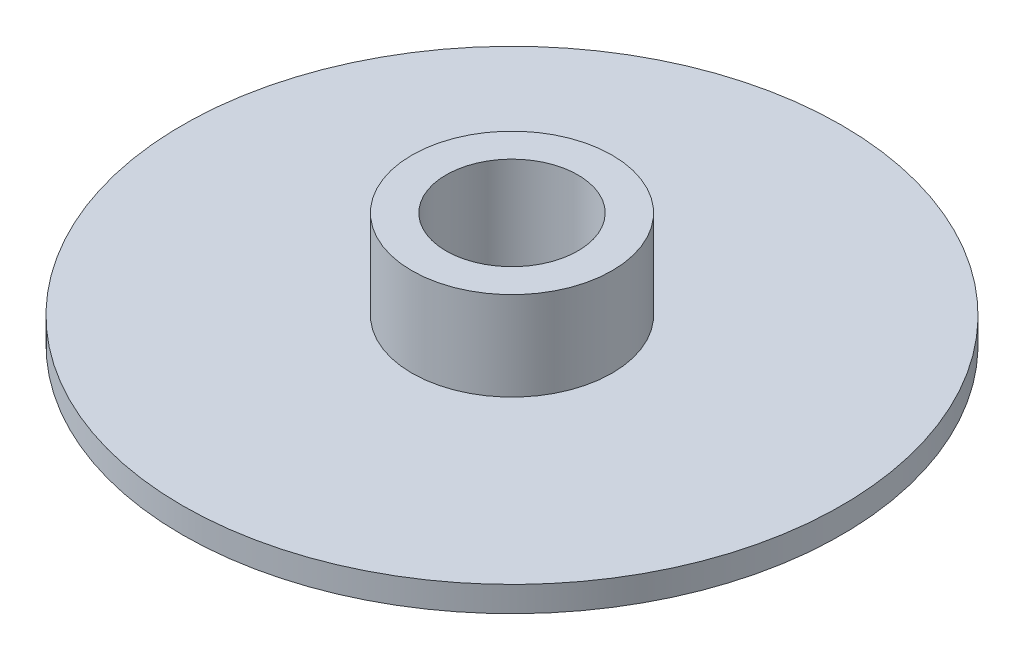
ISO-10303-21;
HEADER;
FILE_DESCRIPTION(('STEP AP214'),'2;1');
FILE_NAME('part.step','',(''),(''),'','','');
FILE_SCHEMA(('AUTOMOTIVE_DESIGN { 1 0 10303 214 1 1 1 1 }'));
ENDSEC;
DATA;
#1=APPLICATION_CONTEXT('core data for automotive mechanical design processes');
#2=APPLICATION_PROTOCOL_DEFINITION('international standard','automotive_design',2000,#1);
#3=PRODUCT_CONTEXT('',#1,'mechanical');
#4=PRODUCT('Part','Part','',(#3));
#5=PRODUCT_RELATED_PRODUCT_CATEGORY('part','',(#4));
#6=PRODUCT_DEFINITION_FORMATION('','',#4);
#7=PRODUCT_DEFINITION_CONTEXT('part definition',#1,'design');
#8=PRODUCT_DEFINITION('design','',#6,#7);
#9=PRODUCT_DEFINITION_SHAPE('','',#8);
#10=(LENGTH_UNIT() NAMED_UNIT(*) SI_UNIT(.MILLI.,.METRE.));
#11=(NAMED_UNIT(*) PLANE_ANGLE_UNIT() SI_UNIT($,.RADIAN.));
#12=(NAMED_UNIT(*) SI_UNIT($,.STERADIAN.) SOLID_ANGLE_UNIT());
#13=UNCERTAINTY_MEASURE_WITH_UNIT(LENGTH_MEASURE(1.E-05),#10,'distance_accuracy_value','');
#14=(GEOMETRIC_REPRESENTATION_CONTEXT(3) GLOBAL_UNCERTAINTY_ASSIGNED_CONTEXT((#13)) GLOBAL_UNIT_ASSIGNED_CONTEXT((#10,
#11,#12)) REPRESENTATION_CONTEXT('',''));
#15=CARTESIAN_POINT('',(0.,0.,0.));
#16=DIRECTION('',(0.,0.,1.));
#17=DIRECTION('',(1.,0.,0.));
#18=AXIS2_PLACEMENT_3D('',#15,#16,#17);
#19=CARTESIAN_POINT('',(0.,1.,0.));
#20=DIRECTION('',(0.,-1.,0.));
#21=DIRECTION('',(0.,0.,-1.));
#22=AXIS2_PLACEMENT_3D('',#19,#20,#21);
#23=CYLINDRICAL_SURFACE('',#22,13.);
#24=CARTESIAN_POINT('',(0.,1.,0.));
#25=DIRECTION('',(0.,1.,0.));
#26=DIRECTION('',(0.,0.,1.));
#27=AXIS2_PLACEMENT_3D('',#24,#25,#26);
#28=CIRCLE('',#27,13.);
#29=CARTESIAN_POINT('',(0.,1.,13.));
#30=VERTEX_POINT('',#29);
#31=EDGE_CURVE('E49',#30,#30,#28,.T.);
#32=ORIENTED_EDGE('',*,*,#31,.F.);
#33=EDGE_LOOP('',(#32));
#34=FACE_BOUND('',#33,.T.);
#35=CARTESIAN_POINT('',(0.,0.,0.));
#36=DIRECTION('',(0.,1.,0.));
#37=DIRECTION('',(0.,0.,1.));
#38=AXIS2_PLACEMENT_3D('',#35,#36,#37);
#39=CIRCLE('',#38,13.);
#40=CARTESIAN_POINT('',(0.,0.,13.));
#41=VERTEX_POINT('',#40);
#42=EDGE_CURVE('E45',#41,#41,#39,.T.);
#43=ORIENTED_EDGE('',*,*,#42,.T.);
#44=EDGE_LOOP('',(#43));
#45=FACE_BOUND('',#44,.T.);
#46=ADVANCED_FACE('F42',(#34,#45),#23,.T.);
#47=CARTESIAN_POINT('',(0.,1.,0.));
#48=DIRECTION('',(0.,1.,0.));
#49=DIRECTION('',(0.,0.,1.));
#50=AXIS2_PLACEMENT_3D('',#47,#48,#49);
#51=PLANE('',#50);
#52=CARTESIAN_POINT('',(0.,1.,0.));
#53=DIRECTION('',(0.,1.,0.));
#54=DIRECTION('',(0.,0.,1.));
#55=AXIS2_PLACEMENT_3D('',#52,#53,#54);
#56=CIRCLE('',#55,3.95);
#57=CARTESIAN_POINT('',(0.,1.,3.95));
#58=VERTEX_POINT('',#57);
#59=EDGE_CURVE('E12',#58,#58,#56,.T.);
#60=ORIENTED_EDGE('',*,*,#59,.F.);
#61=EDGE_LOOP('',(#60));
#62=FACE_BOUND('',#61,.T.);
#63=ORIENTED_EDGE('',*,*,#31,.T.);
#64=EDGE_LOOP('',(#63));
#65=FACE_BOUND('',#64,.T.);
#66=ADVANCED_FACE('F86',(#62,#65),#51,.T.);
#67=CARTESIAN_POINT('',(0.,0.,0.));
#68=DIRECTION('',(0.,1.,0.));
#69=DIRECTION('',(0.,0.,1.));
#70=AXIS2_PLACEMENT_3D('',#67,#68,#69);
#71=PLANE('',#70);
#72=CARTESIAN_POINT('',(0.,0.,0.));
#73=DIRECTION('',(0.,1.,0.));
#74=DIRECTION('',(0.,0.,1.));
#75=AXIS2_PLACEMENT_3D('',#72,#73,#74);
#76=CIRCLE('',#75,2.6);
#77=CARTESIAN_POINT('',(0.,0.,2.6));
#78=VERTEX_POINT('',#77);
#79=EDGE_CURVE('E58',#78,#78,#76,.T.);
#80=ORIENTED_EDGE('',*,*,#79,.T.);
#81=EDGE_LOOP('',(#80));
#82=FACE_BOUND('',#81,.T.);
#83=ORIENTED_EDGE('',*,*,#42,.F.);
#84=EDGE_LOOP('',(#83));
#85=FACE_BOUND('',#84,.T.);
#86=ADVANCED_FACE('F65',(#82,#85),#71,.F.);
#87=CARTESIAN_POINT('',(0.,4.5,0.));
#88=DIRECTION('',(0.,-1.,0.));
#89=DIRECTION('',(0.,0.,-1.));
#90=AXIS2_PLACEMENT_3D('',#87,#88,#89);
#91=CYLINDRICAL_SURFACE('',#90,3.95);
#92=CARTESIAN_POINT('',(0.,4.5,0.));
#93=DIRECTION('',(0.,1.,0.));
#94=DIRECTION('',(0.,0.,1.));
#95=AXIS2_PLACEMENT_3D('',#92,#93,#94);
#96=CIRCLE('',#95,3.95);
#97=CARTESIAN_POINT('',(0.,4.5,3.95));
#98=VERTEX_POINT('',#97);
#99=EDGE_CURVE('E55',#98,#98,#96,.T.);
#100=ORIENTED_EDGE('',*,*,#99,.F.);
#101=EDGE_LOOP('',(#100));
#102=FACE_BOUND('',#101,.T.);
#103=ORIENTED_EDGE('',*,*,#59,.T.);
#104=EDGE_LOOP('',(#103));
#105=FACE_BOUND('',#104,.T.);
#106=ADVANCED_FACE('F77',(#102,#105),#91,.T.);
#107=CARTESIAN_POINT('',(0.,4.5,0.));
#108=DIRECTION('',(0.,1.,0.));
#109=DIRECTION('',(0.,0.,1.));
#110=AXIS2_PLACEMENT_3D('',#107,#108,#109);
#111=PLANE('',#110);
#112=CARTESIAN_POINT('',(0.,4.5,0.));
#113=DIRECTION('',(0.,1.,0.));
#114=DIRECTION('',(0.,0.,1.));
#115=AXIS2_PLACEMENT_3D('',#112,#113,#114);
#116=CIRCLE('',#115,2.6);
#117=CARTESIAN_POINT('',(0.,4.5,2.6));
#118=VERTEX_POINT('',#117);
#119=EDGE_CURVE('E59',#118,#118,#116,.T.);
#120=ORIENTED_EDGE('',*,*,#119,.F.);
#121=EDGE_LOOP('',(#120));
#122=FACE_BOUND('',#121,.T.);
#123=ORIENTED_EDGE('',*,*,#99,.T.);
#124=EDGE_LOOP('',(#123));
#125=FACE_BOUND('',#124,.T.);
#126=ADVANCED_FACE('F71',(#122,#125),#111,.T.);
#127=CARTESIAN_POINT('',(0.,0.,0.));
#128=DIRECTION('',(0.,1.,0.));
#129=DIRECTION('',(0.,0.,1.));
#130=AXIS2_PLACEMENT_3D('',#127,#128,#129);
#131=CYLINDRICAL_SURFACE('',#130,2.6);
#132=ORIENTED_EDGE('',*,*,#79,.F.);
#133=EDGE_LOOP('',(#132));
#134=FACE_BOUND('',#133,.T.);
#135=ORIENTED_EDGE('',*,*,#119,.T.);
#136=EDGE_LOOP('',(#135));
#137=FACE_BOUND('',#136,.T.);
#138=ADVANCED_FACE('F68',(#134,#137),#131,.F.);
#139=CLOSED_SHELL('',(#46,#66,#86,#106,#126,#138));
#140=MANIFOLD_SOLID_BREP('B2',#139);
#141=ADVANCED_BREP_SHAPE_REPRESENTATION('',(#18,#140),#14);
#142=SHAPE_DEFINITION_REPRESENTATION(#9,#141);
ENDSEC;
END-ISO-10303-21;
